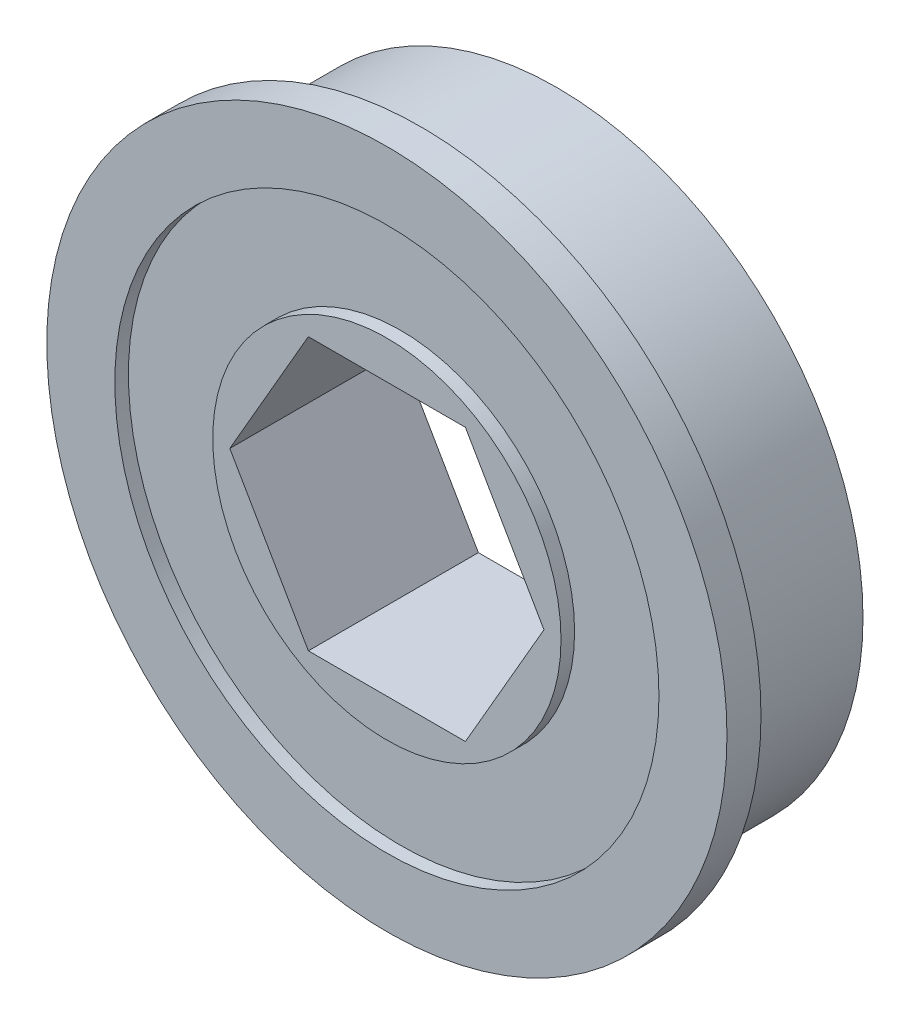
ISO-10303-21;
HEADER;
FILE_DESCRIPTION(('STEP AP214'),'2;1');
FILE_NAME('part.step','',(''),(''),'','','');
FILE_SCHEMA(('AUTOMOTIVE_DESIGN { 1 0 10303 214 1 1 1 1 }'));
ENDSEC;
DATA;
#1=APPLICATION_CONTEXT('core data for automotive mechanical design processes');
#2=APPLICATION_PROTOCOL_DEFINITION('international standard','automotive_design',2000,#1);
#3=PRODUCT_CONTEXT('',#1,'mechanical');
#4=PRODUCT('Part','Part','',(#3));
#5=PRODUCT_RELATED_PRODUCT_CATEGORY('part','',(#4));
#6=PRODUCT_DEFINITION_FORMATION('','',#4);
#7=PRODUCT_DEFINITION_CONTEXT('part definition',#1,'design');
#8=PRODUCT_DEFINITION('design','',#6,#7);
#9=PRODUCT_DEFINITION_SHAPE('','',#8);
#10=(LENGTH_UNIT() NAMED_UNIT(*) SI_UNIT(.MILLI.,.METRE.));
#11=(NAMED_UNIT(*) PLANE_ANGLE_UNIT() SI_UNIT($,.RADIAN.));
#12=(NAMED_UNIT(*) SI_UNIT($,.STERADIAN.) SOLID_ANGLE_UNIT());
#13=UNCERTAINTY_MEASURE_WITH_UNIT(LENGTH_MEASURE(1.E-05),#10,'distance_accuracy_value','');
#14=(GEOMETRIC_REPRESENTATION_CONTEXT(3) GLOBAL_UNCERTAINTY_ASSIGNED_CONTEXT((#13)) GLOBAL_UNIT_ASSIGNED_CONTEXT((#10,
#11,#12)) REPRESENTATION_CONTEXT('',''));
#15=CARTESIAN_POINT('',(0.,0.,0.));
#16=DIRECTION('',(0.,0.,1.));
#17=DIRECTION('',(1.,0.,0.));
#18=AXIS2_PLACEMENT_3D('',#15,#16,#17);
#19=CARTESIAN_POINT('',(0.,0.,-3.96875));
#20=DIRECTION('',(0.,0.,1.));
#21=DIRECTION('',(1.,0.,0.));
#22=AXIS2_PLACEMENT_3D('',#19,#20,#21);
#23=CYLINDRICAL_SURFACE('',#22,12.7);
#24=CARTESIAN_POINT('',(0.,0.,-3.33375));
#25=DIRECTION('',(0.,0.,1.));
#26=DIRECTION('',(1.,0.,0.));
#27=AXIS2_PLACEMENT_3D('',#24,#25,#26);
#28=CIRCLE('',#27,12.7);
#29=CARTESIAN_POINT('',(12.7,0.,-3.33375));
#30=VERTEX_POINT('',#29);
#31=EDGE_CURVE('E138',#30,#30,#28,.F.);
#32=ORIENTED_EDGE('',*,*,#31,.F.);
#33=EDGE_LOOP('',(#32));
#34=FACE_BOUND('',#33,.T.);
#35=CARTESIAN_POINT('',(0.,0.,-3.96875));
#36=DIRECTION('',(0.,0.,1.));
#37=DIRECTION('',(1.,0.,0.));
#38=AXIS2_PLACEMENT_3D('',#35,#36,#37);
#39=CIRCLE('',#38,12.7);
#40=CARTESIAN_POINT('',(12.7,0.,-3.96875));
#41=VERTEX_POINT('',#40);
#42=EDGE_CURVE('E21',#41,#41,#39,.T.);
#43=ORIENTED_EDGE('',*,*,#42,.F.);
#44=EDGE_LOOP('',(#43));
#45=FACE_BOUND('',#44,.T.);
#46=ADVANCED_FACE('F18',(#34,#45),#23,.F.);
#47=CARTESIAN_POINT('',(14.2875,0.,-3.96875));
#48=DIRECTION('',(0.,0.,-1.));
#49=DIRECTION('',(-1.,0.,0.));
#50=AXIS2_PLACEMENT_3D('',#47,#48,#49);
#51=PLANE('',#50);
#52=CARTESIAN_POINT('',(0.,0.,-3.96875));
#53=DIRECTION('',(0.,0.,1.));
#54=DIRECTION('',(1.,0.,0.));
#55=AXIS2_PLACEMENT_3D('',#52,#53,#54);
#56=CIRCLE('',#55,14.2875);
#57=CARTESIAN_POINT('',(14.2875,0.,-3.96875));
#58=VERTEX_POINT('',#57);
#59=EDGE_CURVE('E135',#58,#58,#56,.T.);
#60=ORIENTED_EDGE('',*,*,#59,.F.);
#61=EDGE_LOOP('',(#60));
#62=FACE_BOUND('',#61,.T.);
#63=ORIENTED_EDGE('',*,*,#42,.T.);
#64=EDGE_LOOP('',(#63));
#65=FACE_BOUND('',#64,.T.);
#66=ADVANCED_FACE('F147',(#62,#65),#51,.T.);
#67=CARTESIAN_POINT('',(12.7,0.,-3.33375));
#68=DIRECTION('',(0.,0.,-1.));
#69=DIRECTION('',(-1.,0.,0.));
#70=AXIS2_PLACEMENT_3D('',#67,#68,#69);
#71=PLANE('',#70);
#72=ORIENTED_EDGE('',*,*,#31,.T.);
#73=EDGE_LOOP('',(#72));
#74=FACE_BOUND('',#73,.T.);
#75=CARTESIAN_POINT('',(0.,0.,-3.33375));
#76=DIRECTION('',(0.,0.,1.));
#77=DIRECTION('',(1.,0.,0.));
#78=AXIS2_PLACEMENT_3D('',#75,#76,#77);
#79=CIRCLE('',#78,8.128);
#80=CARTESIAN_POINT('',(8.128,0.,-3.33375));
#81=VERTEX_POINT('',#80);
#82=EDGE_CURVE('E131',#81,#81,#79,.F.);
#83=ORIENTED_EDGE('',*,*,#82,.F.);
#84=EDGE_LOOP('',(#83));
#85=FACE_BOUND('',#84,.T.);
#86=ADVANCED_FACE('F154',(#74,#85),#71,.T.);
#87=CARTESIAN_POINT('',(0.,0.,-3.96875));
#88=DIRECTION('',(0.,0.,1.));
#89=DIRECTION('',(1.,0.,0.));
#90=AXIS2_PLACEMENT_3D('',#87,#88,#89);
#91=CYLINDRICAL_SURFACE('',#90,14.2875);
#92=ORIENTED_EDGE('',*,*,#59,.T.);
#93=EDGE_LOOP('',(#92));
#94=FACE_BOUND('',#93,.T.);
#95=CARTESIAN_POINT('',(0.,0.,2.38125));
#96=DIRECTION('',(0.,0.,1.));
#97=DIRECTION('',(1.,0.,0.));
#98=AXIS2_PLACEMENT_3D('',#95,#96,#97);
#99=CIRCLE('',#98,14.2875);
#100=CARTESIAN_POINT('',(14.2875,0.,2.38125));
#101=VERTEX_POINT('',#100);
#102=EDGE_CURVE('E127',#101,#101,#99,.T.);
#103=ORIENTED_EDGE('',*,*,#102,.F.);
#104=EDGE_LOOP('',(#103));
#105=FACE_BOUND('',#104,.T.);
#106=ADVANCED_FACE('F213',(#94,#105),#91,.T.);
#107=CARTESIAN_POINT('',(0.,0.,-3.96875));
#108=DIRECTION('',(0.,0.,1.));
#109=DIRECTION('',(1.,0.,0.));
#110=AXIS2_PLACEMENT_3D('',#107,#108,#109);
#111=CYLINDRICAL_SURFACE('',#110,8.128);
#112=CARTESIAN_POINT('',(0.,0.,-3.96875));
#113=DIRECTION('',(0.,0.,1.));
#114=DIRECTION('',(1.,0.,0.));
#115=AXIS2_PLACEMENT_3D('',#112,#113,#114);
#116=CIRCLE('',#115,8.128);
#117=CARTESIAN_POINT('',(8.128,0.,-3.96875));
#118=VERTEX_POINT('',#117);
#119=EDGE_CURVE('E123',#118,#118,#116,.F.);
#120=ORIENTED_EDGE('',*,*,#119,.F.);
#121=EDGE_LOOP('',(#120));
#122=FACE_BOUND('',#121,.T.);
#123=ORIENTED_EDGE('',*,*,#82,.T.);
#124=EDGE_LOOP('',(#123));
#125=FACE_BOUND('',#124,.T.);
#126=ADVANCED_FACE('F209',(#122,#125),#111,.T.);
#127=CARTESIAN_POINT('',(15.875,0.,2.38125));
#128=DIRECTION('',(0.,0.,-1.));
#129=DIRECTION('',(-1.,0.,0.));
#130=AXIS2_PLACEMENT_3D('',#127,#128,#129);
#131=PLANE('',#130);
#132=CARTESIAN_POINT('',(0.,0.,2.38125));
#133=DIRECTION('',(0.,0.,1.));
#134=DIRECTION('',(1.,0.,0.));
#135=AXIS2_PLACEMENT_3D('',#132,#133,#134);
#136=CIRCLE('',#135,15.875);
#137=CARTESIAN_POINT('',(15.875,0.,2.38125));
#138=VERTEX_POINT('',#137);
#139=EDGE_CURVE('E84',#138,#138,#136,.T.);
#140=ORIENTED_EDGE('',*,*,#139,.F.);
#141=EDGE_LOOP('',(#140));
#142=FACE_BOUND('',#141,.T.);
#143=ORIENTED_EDGE('',*,*,#102,.T.);
#144=EDGE_LOOP('',(#143));
#145=FACE_BOUND('',#144,.T.);
#146=ADVANCED_FACE('F205',(#142,#145),#131,.T.);
#147=CARTESIAN_POINT('',(8.128,0.,-3.96875));
#148=DIRECTION('',(0.,0.,-1.));
#149=DIRECTION('',(-1.,0.,0.));
#150=AXIS2_PLACEMENT_3D('',#147,#148,#149);
#151=PLANE('',#150);
#152=ORIENTED_EDGE('',*,*,#119,.T.);
#153=EDGE_LOOP('',(#152));
#154=FACE_BOUND('',#153,.T.);
#155=DIRECTION('',(0.5,-0.866025403784439,0.));
#156=VECTOR('',#155,1.);
#157=CARTESIAN_POINT('',(-3.66617420935412,-6.35,-3.96875));
#158=LINE('',#157,#156);
#159=CARTESIAN_POINT('',(-7.33234841870825,0.,-3.96875));
#160=VERTEX_POINT('',#159);
#161=CARTESIAN_POINT('',(-3.66617420935412,-6.35,-3.96875));
#162=VERTEX_POINT('',#161);
#163=EDGE_CURVE('E74',#160,#162,#158,.T.);
#164=ORIENTED_EDGE('',*,*,#163,.T.);
#165=DIRECTION('',(1.,0.,0.));
#166=VECTOR('',#165,1.);
#167=CARTESIAN_POINT('',(3.66617420935413,-6.35,-3.96875));
#168=LINE('',#167,#166);
#169=CARTESIAN_POINT('',(3.66617420935412,-6.35,-3.96875));
#170=VERTEX_POINT('',#169);
#171=EDGE_CURVE('E119',#162,#170,#168,.T.);
#172=ORIENTED_EDGE('',*,*,#171,.T.);
#173=DIRECTION('',(0.5,0.866025403784439,0.));
#174=VECTOR('',#173,1.);
#175=CARTESIAN_POINT('',(7.33234841870825,0.,-3.96875));
#176=LINE('',#175,#174);
#177=CARTESIAN_POINT('',(7.33234841870825,0.,-3.96875));
#178=VERTEX_POINT('',#177);
#179=EDGE_CURVE('E384',#170,#178,#176,.T.);
#180=ORIENTED_EDGE('',*,*,#179,.T.);
#181=DIRECTION('',(-0.5,0.866025403784439,0.));
#182=VECTOR('',#181,1.);
#183=CARTESIAN_POINT('',(3.66617420935412,6.35000000000001,-3.96875));
#184=LINE('',#183,#182);
#185=CARTESIAN_POINT('',(3.66617420935412,6.35000000000001,-3.96875));
#186=VERTEX_POINT('',#185);
#187=EDGE_CURVE('E359',#178,#186,#184,.T.);
#188=ORIENTED_EDGE('',*,*,#187,.T.);
#189=DIRECTION('',(1.,0.,0.));
#190=VECTOR('',#189,1.);
#191=CARTESIAN_POINT('',(-3.66617420935412,6.35000000000001,-3.96875));
#192=LINE('',#191,#190);
#193=CARTESIAN_POINT('',(-3.66617420935412,6.35000000000001,-3.96875));
#194=VERTEX_POINT('',#193);
#195=EDGE_CURVE('E88',#186,#194,#192,.F.);
#196=ORIENTED_EDGE('',*,*,#195,.T.);
#197=DIRECTION('',(-0.5,-0.866025403784439,0.));
#198=VECTOR('',#197,1.);
#199=CARTESIAN_POINT('',(-7.33234841870824,0.,-3.96875));
#200=LINE('',#199,#198);
#201=EDGE_CURVE('E69',#194,#160,#200,.T.);
#202=ORIENTED_EDGE('',*,*,#201,.T.);
#203=EDGE_LOOP('',(#164,#172,#180,#188,#196,#202));
#204=FACE_BOUND('',#203,.T.);
#205=ADVANCED_FACE('F86',(#154,#204),#151,.T.);
#206=CARTESIAN_POINT('',(0.,0.,-3.96875));
#207=DIRECTION('',(0.,0.,1.));
#208=DIRECTION('',(1.,0.,0.));
#209=AXIS2_PLACEMENT_3D('',#206,#207,#208);
#210=CYLINDRICAL_SURFACE('',#209,15.875);
#211=ORIENTED_EDGE('',*,*,#139,.T.);
#212=EDGE_LOOP('',(#211));
#213=FACE_BOUND('',#212,.T.);
#214=CARTESIAN_POINT('',(0.,0.,3.96875));
#215=DIRECTION('',(0.,0.,1.));
#216=DIRECTION('',(1.,0.,0.));
#217=AXIS2_PLACEMENT_3D('',#214,#215,#216);
#218=CIRCLE('',#217,15.875);
#219=CARTESIAN_POINT('',(15.875,0.,3.96875));
#220=VERTEX_POINT('',#219);
#221=EDGE_CURVE('E114',#220,#220,#218,.T.);
#222=ORIENTED_EDGE('',*,*,#221,.F.);
#223=EDGE_LOOP('',(#222));
#224=FACE_BOUND('',#223,.T.);
#225=ADVANCED_FACE('F199',(#213,#224),#210,.T.);
#226=CARTESIAN_POINT('',(-3.66617420935412,-6.35,3.96875));
#227=DIRECTION('',(-0.866025403784439,-0.5,0.));
#228=DIRECTION('',(0.5,-0.866025403784439,0.));
#229=AXIS2_PLACEMENT_3D('',#226,#227,#228);
#230=PLANE('',#229);
#231=DIRECTION('',(0.,0.,1.));
#232=VECTOR('',#231,1.);
#233=CARTESIAN_POINT('',(-7.33234841870824,0.,3.96875));
#234=LINE('',#233,#232);
#235=CARTESIAN_POINT('',(-7.33234841870824,0.,3.96875));
#236=VERTEX_POINT('',#235);
#237=EDGE_CURVE('E76',#160,#236,#234,.T.);
#238=ORIENTED_EDGE('',*,*,#237,.T.);
#239=DIRECTION('',(-0.499999999999999,0.866025403784439,0.));
#240=VECTOR('',#239,1.);
#241=CARTESIAN_POINT('',(-3.66617420935412,-6.35,3.96875));
#242=LINE('',#241,#240);
#243=CARTESIAN_POINT('',(-3.66617420935412,-6.35,3.96875));
#244=VERTEX_POINT('',#243);
#245=EDGE_CURVE('E118',#244,#236,#242,.T.);
#246=ORIENTED_EDGE('',*,*,#245,.F.);
#247=DIRECTION('',(0.,0.,1.));
#248=VECTOR('',#247,1.);
#249=CARTESIAN_POINT('',(-3.66617420935412,-6.35,3.96875));
#250=LINE('',#249,#248);
#251=EDGE_CURVE('E79',#244,#162,#250,.F.);
#252=ORIENTED_EDGE('',*,*,#251,.T.);
#253=ORIENTED_EDGE('',*,*,#163,.F.);
#254=EDGE_LOOP('',(#238,#246,#252,#253));
#255=FACE_BOUND('',#254,.T.);
#256=ADVANCED_FACE('F75',(#255),#230,.F.);
#257=CARTESIAN_POINT('',(-7.33234841870824,0.,3.96875));
#258=DIRECTION('',(-0.866025403784439,0.5,0.));
#259=DIRECTION('',(-0.5,-0.866025403784439,0.));
#260=AXIS2_PLACEMENT_3D('',#257,#258,#259);
#261=PLANE('',#260);
#262=DIRECTION('',(0.,0.,1.));
#263=VECTOR('',#262,1.);
#264=CARTESIAN_POINT('',(-3.66617420935412,6.35000000000001,3.96875));
#265=LINE('',#264,#263);
#266=CARTESIAN_POINT('',(-3.66617420935412,6.35000000000001,3.96875));
#267=VERTEX_POINT('',#266);
#268=EDGE_CURVE('E91',#194,#267,#265,.T.);
#269=ORIENTED_EDGE('',*,*,#268,.T.);
#270=DIRECTION('',(0.5,0.866025403784439,0.));
#271=VECTOR('',#270,1.);
#272=CARTESIAN_POINT('',(-7.33234841870824,0.,3.96875));
#273=LINE('',#272,#271);
#274=EDGE_CURVE('E95',#236,#267,#273,.T.);
#275=ORIENTED_EDGE('',*,*,#274,.F.);
#276=ORIENTED_EDGE('',*,*,#237,.F.);
#277=ORIENTED_EDGE('',*,*,#201,.F.);
#278=EDGE_LOOP('',(#269,#275,#276,#277));
#279=FACE_BOUND('',#278,.T.);
#280=ADVANCED_FACE('F93',(#279),#261,.F.);
#281=CARTESIAN_POINT('',(-3.66617420935412,6.35000000000001,3.96875));
#282=DIRECTION('',(0.,1.,0.));
#283=DIRECTION('',(0.,0.,1.));
#284=AXIS2_PLACEMENT_3D('',#281,#282,#283);
#285=PLANE('',#284);
#286=DIRECTION('',(0.,0.,1.));
#287=VECTOR('',#286,1.);
#288=CARTESIAN_POINT('',(3.66617420935412,6.35000000000001,3.96875));
#289=LINE('',#288,#287);
#290=CARTESIAN_POINT('',(3.66617420935412,6.35000000000001,3.96875));
#291=VERTEX_POINT('',#290);
#292=EDGE_CURVE('E354',#186,#291,#289,.T.);
#293=ORIENTED_EDGE('',*,*,#292,.T.);
#294=DIRECTION('',(1.,0.,0.));
#295=VECTOR('',#294,1.);
#296=CARTESIAN_POINT('',(6.35,6.35000000000001,3.96875));
#297=LINE('',#296,#295);
#298=EDGE_CURVE('E357',#267,#291,#297,.T.);
#299=ORIENTED_EDGE('',*,*,#298,.F.);
#300=ORIENTED_EDGE('',*,*,#268,.F.);
#301=ORIENTED_EDGE('',*,*,#195,.F.);
#302=EDGE_LOOP('',(#293,#299,#300,#301));
#303=FACE_BOUND('',#302,.T.);
#304=ADVANCED_FACE('F190',(#303),#285,.F.);
#305=CARTESIAN_POINT('',(3.66617420935412,6.35000000000001,3.96875));
#306=DIRECTION('',(0.866025403784439,0.5,0.));
#307=DIRECTION('',(-0.5,0.866025403784439,0.));
#308=AXIS2_PLACEMENT_3D('',#305,#306,#307);
#309=PLANE('',#308);
#310=DIRECTION('',(0.,0.,1.));
#311=VECTOR('',#310,1.);
#312=CARTESIAN_POINT('',(7.33234841870825,0.,3.96875));
#313=LINE('',#312,#311);
#314=CARTESIAN_POINT('',(7.33234841870825,0.,3.96875));
#315=VERTEX_POINT('',#314);
#316=EDGE_CURVE('E364',#178,#315,#313,.T.);
#317=ORIENTED_EDGE('',*,*,#316,.T.);
#318=DIRECTION('',(0.5,-0.866025403784439,0.));
#319=VECTOR('',#318,1.);
#320=CARTESIAN_POINT('',(3.66617420935412,6.35000000000001,3.96875));
#321=LINE('',#320,#319);
#322=EDGE_CURVE('E362',#291,#315,#321,.T.);
#323=ORIENTED_EDGE('',*,*,#322,.F.);
#324=ORIENTED_EDGE('',*,*,#292,.F.);
#325=ORIENTED_EDGE('',*,*,#187,.F.);
#326=EDGE_LOOP('',(#317,#323,#324,#325));
#327=FACE_BOUND('',#326,.T.);
#328=ADVANCED_FACE('F187',(#327),#309,.F.);
#329=CARTESIAN_POINT('',(7.33234841870825,0.,3.96875));
#330=DIRECTION('',(0.866025403784439,-0.5,0.));
#331=DIRECTION('',(0.5,0.866025403784439,0.));
#332=AXIS2_PLACEMENT_3D('',#329,#330,#331);
#333=PLANE('',#332);
#334=DIRECTION('',(0.,0.,1.));
#335=VECTOR('',#334,1.);
#336=CARTESIAN_POINT('',(3.66617420935413,-6.35,3.96875));
#337=LINE('',#336,#335);
#338=CARTESIAN_POINT('',(3.66617420935412,-6.35,3.96875));
#339=VERTEX_POINT('',#338);
#340=EDGE_CURVE('E37',#170,#339,#337,.T.);
#341=ORIENTED_EDGE('',*,*,#340,.T.);
#342=DIRECTION('',(-0.5,-0.866025403784438,0.));
#343=VECTOR('',#342,1.);
#344=CARTESIAN_POINT('',(7.33234841870825,0.,3.96875));
#345=LINE('',#344,#343);
#346=EDGE_CURVE('E368',#315,#339,#345,.T.);
#347=ORIENTED_EDGE('',*,*,#346,.F.);
#348=ORIENTED_EDGE('',*,*,#316,.F.);
#349=ORIENTED_EDGE('',*,*,#179,.F.);
#350=EDGE_LOOP('',(#341,#347,#348,#349));
#351=FACE_BOUND('',#350,.T.);
#352=ADVANCED_FACE('F183',(#351),#333,.F.);
#353=CARTESIAN_POINT('',(3.66617420935413,-6.35,3.96875));
#354=DIRECTION('',(0.,-1.,0.));
#355=DIRECTION('',(1.,0.,0.));
#356=AXIS2_PLACEMENT_3D('',#353,#354,#355);
#357=PLANE('',#356);
#358=ORIENTED_EDGE('',*,*,#251,.F.);
#359=DIRECTION('',(1.,0.,0.));
#360=VECTOR('',#359,1.);
#361=CARTESIAN_POINT('',(6.35,-6.35,3.96875));
#362=LINE('',#361,#360);
#363=EDGE_CURVE('E113',#339,#244,#362,.F.);
#364=ORIENTED_EDGE('',*,*,#363,.F.);
#365=ORIENTED_EDGE('',*,*,#340,.F.);
#366=ORIENTED_EDGE('',*,*,#171,.F.);
#367=EDGE_LOOP('',(#358,#364,#365,#366));
#368=FACE_BOUND('',#367,.T.);
#369=ADVANCED_FACE('F179',(#368),#357,.F.);
#370=CARTESIAN_POINT('',(12.7,0.,3.96875));
#371=DIRECTION('',(0.,0.,1.));
#372=DIRECTION('',(1.,0.,0.));
#373=AXIS2_PLACEMENT_3D('',#370,#371,#372);
#374=PLANE('',#373);
#375=CARTESIAN_POINT('',(0.,0.,3.96875));
#376=DIRECTION('',(0.,0.,1.));
#377=DIRECTION('',(1.,0.,0.));
#378=AXIS2_PLACEMENT_3D('',#375,#376,#377);
#379=CIRCLE('',#378,12.7);
#380=CARTESIAN_POINT('',(12.7,0.,3.96875));
#381=VERTEX_POINT('',#380);
#382=EDGE_CURVE('E109',#381,#381,#379,.F.);
#383=ORIENTED_EDGE('',*,*,#382,.T.);
#384=EDGE_LOOP('',(#383));
#385=FACE_BOUND('',#384,.T.);
#386=ORIENTED_EDGE('',*,*,#221,.T.);
#387=EDGE_LOOP('',(#386));
#388=FACE_BOUND('',#387,.T.);
#389=ADVANCED_FACE('F175',(#385,#388),#374,.T.);
#390=CARTESIAN_POINT('',(6.35,0.,3.96875));
#391=DIRECTION('',(0.,0.,1.));
#392=DIRECTION('',(1.,0.,0.));
#393=AXIS2_PLACEMENT_3D('',#390,#391,#392);
#394=PLANE('',#393);
#395=CARTESIAN_POINT('',(0.,0.,3.96875));
#396=DIRECTION('',(0.,0.,1.));
#397=DIRECTION('',(1.,0.,0.));
#398=AXIS2_PLACEMENT_3D('',#395,#396,#397);
#399=CIRCLE('',#398,8.128);
#400=CARTESIAN_POINT('',(8.128,0.,3.96875));
#401=VERTEX_POINT('',#400);
#402=EDGE_CURVE('E105',#401,#401,#399,.F.);
#403=ORIENTED_EDGE('',*,*,#402,.F.);
#404=EDGE_LOOP('',(#403));
#405=FACE_BOUND('',#404,.T.);
#406=ORIENTED_EDGE('',*,*,#346,.T.);
#407=ORIENTED_EDGE('',*,*,#363,.T.);
#408=ORIENTED_EDGE('',*,*,#245,.T.);
#409=ORIENTED_EDGE('',*,*,#274,.T.);
#410=ORIENTED_EDGE('',*,*,#298,.T.);
#411=ORIENTED_EDGE('',*,*,#322,.T.);
#412=EDGE_LOOP('',(#406,#407,#408,#409,#410,#411));
#413=FACE_BOUND('',#412,.T.);
#414=ADVANCED_FACE('F171',(#405,#413),#394,.T.);
#415=CARTESIAN_POINT('',(0.,0.,-3.96875));
#416=DIRECTION('',(0.,0.,1.));
#417=DIRECTION('',(1.,0.,0.));
#418=AXIS2_PLACEMENT_3D('',#415,#416,#417);
#419=CYLINDRICAL_SURFACE('',#418,12.7);
#420=ORIENTED_EDGE('',*,*,#382,.F.);
#421=EDGE_LOOP('',(#420));
#422=FACE_BOUND('',#421,.T.);
#423=CARTESIAN_POINT('',(0.,0.,3.33375));
#424=DIRECTION('',(0.,0.,1.));
#425=DIRECTION('',(1.,0.,0.));
#426=AXIS2_PLACEMENT_3D('',#423,#424,#425);
#427=CIRCLE('',#426,12.7);
#428=CARTESIAN_POINT('',(12.7,0.,3.33375));
#429=VERTEX_POINT('',#428);
#430=EDGE_CURVE('E28',#429,#429,#427,.T.);
#431=ORIENTED_EDGE('',*,*,#430,.F.);
#432=EDGE_LOOP('',(#431));
#433=FACE_BOUND('',#432,.T.);
#434=ADVANCED_FACE('F164',(#422,#433),#419,.F.);
#435=CARTESIAN_POINT('',(0.,0.,-3.96875));
#436=DIRECTION('',(0.,0.,1.));
#437=DIRECTION('',(1.,0.,0.));
#438=AXIS2_PLACEMENT_3D('',#435,#436,#437);
#439=CYLINDRICAL_SURFACE('',#438,8.128);
#440=CARTESIAN_POINT('',(0.,0.,3.33375));
#441=DIRECTION('',(0.,0.,1.));
#442=DIRECTION('',(1.,0.,0.));
#443=AXIS2_PLACEMENT_3D('',#440,#441,#442);
#444=CIRCLE('',#443,8.128);
#445=CARTESIAN_POINT('',(8.128,0.,3.33375));
#446=VERTEX_POINT('',#445);
#447=EDGE_CURVE('E11',#446,#446,#444,.F.);
#448=ORIENTED_EDGE('',*,*,#447,.F.);
#449=EDGE_LOOP('',(#448));
#450=FACE_BOUND('',#449,.T.);
#451=ORIENTED_EDGE('',*,*,#402,.T.);
#452=EDGE_LOOP('',(#451));
#453=FACE_BOUND('',#452,.T.);
#454=ADVANCED_FACE('F158',(#450,#453),#439,.T.);
#455=CARTESIAN_POINT('',(8.128,0.,3.33375));
#456=DIRECTION('',(0.,0.,1.));
#457=DIRECTION('',(1.,0.,0.));
#458=AXIS2_PLACEMENT_3D('',#455,#456,#457);
#459=PLANE('',#458);
#460=ORIENTED_EDGE('',*,*,#447,.T.);
#461=EDGE_LOOP('',(#460));
#462=FACE_BOUND('',#461,.T.);
#463=ORIENTED_EDGE('',*,*,#430,.T.);
#464=EDGE_LOOP('',(#463));
#465=FACE_BOUND('',#464,.T.);
#466=ADVANCED_FACE('F156',(#462,#465),#459,.T.);
#467=CLOSED_SHELL('',(#46,#66,#86,#106,#126,#146,#205,#225,#256,#280,#304,#328,#352,#369,#389,
#414,#434,#454,#466));
#468=MANIFOLD_SOLID_BREP('B1',#467);
#469=ADVANCED_BREP_SHAPE_REPRESENTATION('',(#18,#468),#14);
#470=SHAPE_DEFINITION_REPRESENTATION(#9,#469);
ENDSEC;
END-ISO-10303-21;
